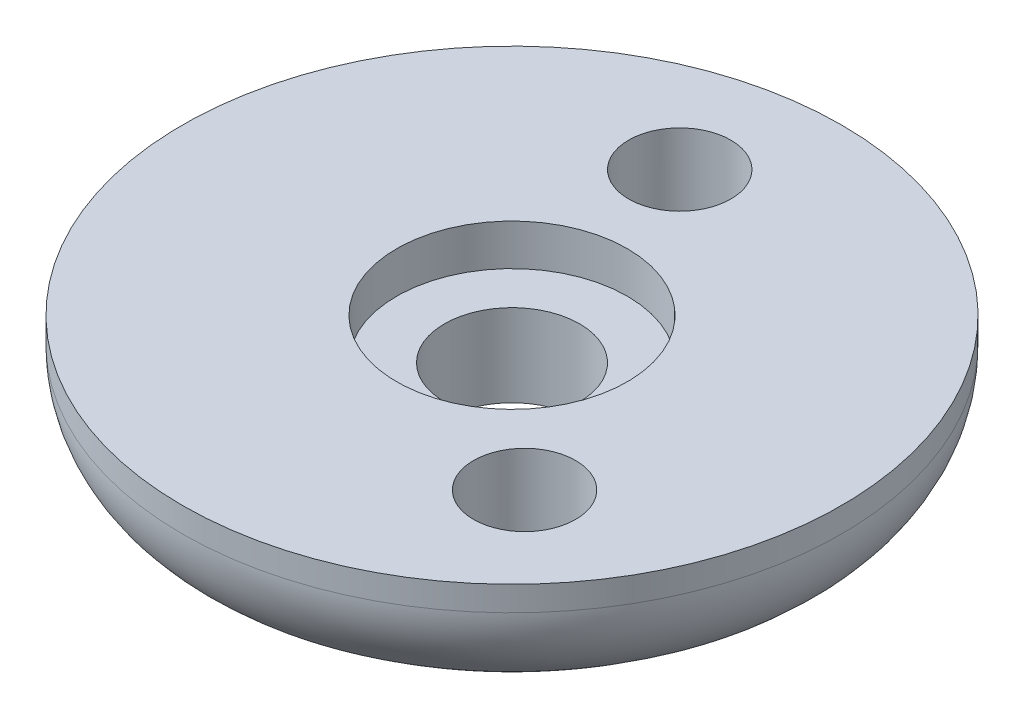
ISO-10303-21;
HEADER;
FILE_DESCRIPTION(('STEP AP214'),'2;1');
FILE_NAME('part.step','',(''),(''),'','','');
FILE_SCHEMA(('AUTOMOTIVE_DESIGN { 1 0 10303 214 1 1 1 1 }'));
ENDSEC;
DATA;
#1=APPLICATION_CONTEXT('core data for automotive mechanical design processes');
#2=APPLICATION_PROTOCOL_DEFINITION('international standard','automotive_design',2000,#1);
#3=PRODUCT_CONTEXT('',#1,'mechanical');
#4=PRODUCT('Part','Part','',(#3));
#5=PRODUCT_RELATED_PRODUCT_CATEGORY('part','',(#4));
#6=PRODUCT_DEFINITION_FORMATION('','',#4);
#7=PRODUCT_DEFINITION_CONTEXT('part definition',#1,'design');
#8=PRODUCT_DEFINITION('design','',#6,#7);
#9=PRODUCT_DEFINITION_SHAPE('','',#8);
#10=(LENGTH_UNIT() NAMED_UNIT(*) SI_UNIT(.MILLI.,.METRE.));
#11=(NAMED_UNIT(*) PLANE_ANGLE_UNIT() SI_UNIT($,.RADIAN.));
#12=(NAMED_UNIT(*) SI_UNIT($,.STERADIAN.) SOLID_ANGLE_UNIT());
#13=UNCERTAINTY_MEASURE_WITH_UNIT(LENGTH_MEASURE(1.E-05),#10,'distance_accuracy_value','');
#14=(GEOMETRIC_REPRESENTATION_CONTEXT(3) GLOBAL_UNCERTAINTY_ASSIGNED_CONTEXT((#13)) GLOBAL_UNIT_ASSIGNED_CONTEXT((#10,
#11,#12)) REPRESENTATION_CONTEXT('',''));
#15=CARTESIAN_POINT('',(0.,0.,0.));
#16=DIRECTION('',(0.,0.,1.));
#17=DIRECTION('',(1.,0.,0.));
#18=AXIS2_PLACEMENT_3D('',#15,#16,#17);
#19=CARTESIAN_POINT('',(0.,-7.5,0.));
#20=DIRECTION('',(0.,1.,0.));
#21=DIRECTION('',(0.,0.,1.));
#22=AXIS2_PLACEMENT_3D('',#19,#20,#21);
#23=CYLINDRICAL_SURFACE('',#22,3.5);
#24=CARTESIAN_POINT('',(0.,-6.25,0.));
#25=DIRECTION('',(0.,-1.,0.));
#26=DIRECTION('',(0.,0.,-1.));
#27=AXIS2_PLACEMENT_3D('',#24,#25,#26);
#28=CIRCLE('',#27,3.5);
#29=CARTESIAN_POINT('',(0.,-6.25,-3.5));
#30=VERTEX_POINT('',#29);
#31=EDGE_CURVE('E135',#30,#30,#28,.T.);
#32=ORIENTED_EDGE('',*,*,#31,.F.);
#33=EDGE_LOOP('',(#32));
#34=FACE_BOUND('',#33,.T.);
#35=CARTESIAN_POINT('',(0.,-7.5,0.));
#36=DIRECTION('',(0.,-1.,0.));
#37=DIRECTION('',(0.,0.,-1.));
#38=AXIS2_PLACEMENT_3D('',#35,#36,#37);
#39=CIRCLE('',#38,3.5);
#40=CARTESIAN_POINT('',(0.,-7.5,-3.5));
#41=VERTEX_POINT('',#40);
#42=EDGE_CURVE('E75',#41,#41,#39,.T.);
#43=ORIENTED_EDGE('',*,*,#42,.T.);
#44=EDGE_LOOP('',(#43));
#45=FACE_BOUND('',#44,.T.);
#46=ADVANCED_FACE('F32',(#34,#45),#23,.F.);
#47=CARTESIAN_POINT('',(0.,-7.5,0.));
#48=DIRECTION('',(0.,-1.,0.));
#49=DIRECTION('',(0.,0.,-1.));
#50=AXIS2_PLACEMENT_3D('',#47,#48,#49);
#51=PLANE('',#50);
#52=CARTESIAN_POINT('',(0.,-7.5,0.));
#53=DIRECTION('',(0.,-1.,0.));
#54=DIRECTION('',(0.,0.,-1.));
#55=AXIS2_PLACEMENT_3D('',#52,#53,#54);
#56=CIRCLE('',#55,2.05);
#57=CARTESIAN_POINT('',(0.,-7.5,-2.05));
#58=VERTEX_POINT('',#57);
#59=EDGE_CURVE('E79',#58,#58,#56,.F.);
#60=ORIENTED_EDGE('',*,*,#59,.F.);
#61=EDGE_LOOP('',(#60));
#62=FACE_BOUND('',#61,.T.);
#63=ORIENTED_EDGE('',*,*,#42,.F.);
#64=EDGE_LOOP('',(#63));
#65=FACE_BOUND('',#64,.T.);
#66=ADVANCED_FACE('F104',(#62,#65),#51,.F.);
#67=CARTESIAN_POINT('',(0.,-10.,0.));
#68=DIRECTION('',(0.,1.,0.));
#69=DIRECTION('',(0.,0.,1.));
#70=AXIS2_PLACEMENT_3D('',#67,#68,#69);
#71=CYLINDRICAL_SURFACE('',#70,2.05);
#72=CARTESIAN_POINT('',(0.,-10.,0.));
#73=DIRECTION('',(0.,-1.,0.));
#74=DIRECTION('',(0.,0.,-1.));
#75=AXIS2_PLACEMENT_3D('',#72,#73,#74);
#76=CIRCLE('',#75,2.05);
#77=CARTESIAN_POINT('',(0.,-10.,-2.05));
#78=VERTEX_POINT('',#77);
#79=EDGE_CURVE('E72',#78,#78,#76,.T.);
#80=ORIENTED_EDGE('',*,*,#79,.T.);
#81=EDGE_LOOP('',(#80));
#82=FACE_BOUND('',#81,.T.);
#83=ORIENTED_EDGE('',*,*,#59,.T.);
#84=EDGE_LOOP('',(#83));
#85=FACE_BOUND('',#84,.T.);
#86=ADVANCED_FACE('F100',(#82,#85),#71,.F.);
#87=CARTESIAN_POINT('',(0.,-10.,0.));
#88=DIRECTION('',(0.,1.,0.));
#89=DIRECTION('',(0.,0.,1.));
#90=AXIS2_PLACEMENT_3D('',#87,#88,#89);
#91=CYLINDRICAL_SURFACE('',#90,10.);
#92=CARTESIAN_POINT('',(0.,-6.25,0.));
#93=DIRECTION('',(0.,-1.,0.));
#94=DIRECTION('',(0.,0.,-1.));
#95=AXIS2_PLACEMENT_3D('',#92,#93,#94);
#96=CIRCLE('',#95,10.);
#97=CARTESIAN_POINT('',(0.,-6.25,-10.));
#98=VERTEX_POINT('',#97);
#99=EDGE_CURVE('E120',#98,#98,#96,.T.);
#100=ORIENTED_EDGE('',*,*,#99,.T.);
#101=EDGE_LOOP('',(#100));
#102=FACE_BOUND('',#101,.T.);
#103=CARTESIAN_POINT('',(0.,-7.,0.));
#104=DIRECTION('',(0.,1.,0.));
#105=DIRECTION('',(0.,0.,1.));
#106=AXIS2_PLACEMENT_3D('',#103,#104,#105);
#107=CIRCLE('',#106,10.);
#108=CARTESIAN_POINT('',(0.,-7.,10.));
#109=VERTEX_POINT('',#108);
#110=EDGE_CURVE('E67',#109,#109,#107,.T.);
#111=ORIENTED_EDGE('',*,*,#110,.T.);
#112=EDGE_LOOP('',(#111));
#113=FACE_BOUND('',#112,.T.);
#114=ADVANCED_FACE('F103',(#102,#113),#91,.T.);
#115=CARTESIAN_POINT('',(0.,-10.,0.));
#116=DIRECTION('',(0.,1.,0.));
#117=DIRECTION('',(0.,0.,1.));
#118=AXIS2_PLACEMENT_3D('',#115,#116,#117);
#119=PLANE('',#118);
#120=CARTESIAN_POINT('',(4.78310190252404,-10.,4.40135617623374));
#121=DIRECTION('',(0.,1.,0.));
#122=DIRECTION('',(0.,0.,1.));
#123=AXIS2_PLACEMENT_3D('',#120,#121,#122);
#124=CIRCLE('',#123,1.55);
#125=CARTESIAN_POINT('',(6.05402523005159,-10.,3.51408288375486));
#126=VERTEX_POINT('',#125);
#127=CARTESIAN_POINT('',(4.00435693052841,-10.,5.74152641489431));
#128=VERTEX_POINT('',#127);
#129=EDGE_CURVE('E64',#126,#128,#124,.T.);
#130=ORIENTED_EDGE('',*,*,#129,.T.);
#131=CARTESIAN_POINT('',(0.,-10.,0.));
#132=DIRECTION('',(0.,1.,0.));
#133=DIRECTION('',(0.,0.,1.));
#134=AXIS2_PLACEMENT_3D('',#131,#132,#133);
#135=CIRCLE('',#134,7.);
#136=CARTESIAN_POINT('',(-2.83228320108191,-10.,-6.40141951983068));
#137=VERTEX_POINT('',#136);
#138=EDGE_CURVE('E11',#128,#137,#135,.F.);
#139=ORIENTED_EDGE('',*,*,#138,.T.);
#140=CARTESIAN_POINT('',(-1.2825584744925,-10.,-6.37220870338594));
#141=DIRECTION('',(0.,1.,0.));
#142=DIRECTION('',(0.,0.,1.));
#143=AXIS2_PLACEMENT_3D('',#140,#141,#142);
#144=CIRCLE('',#143,1.55);
#145=CARTESIAN_POINT('',(0.135191743981975,-10.,-6.99869439198192));
#146=VERTEX_POINT('',#145);
#147=EDGE_CURVE('E65',#137,#146,#144,.T.);
#148=ORIENTED_EDGE('',*,*,#147,.T.);
#149=CARTESIAN_POINT('',(0.,-10.,0.));
#150=DIRECTION('',(0.,1.,0.));
#151=DIRECTION('',(0.,0.,1.));
#152=AXIS2_PLACEMENT_3D('',#149,#150,#151);
#153=CIRCLE('',#152,7.);
#154=EDGE_CURVE('E42',#146,#126,#153,.F.);
#155=ORIENTED_EDGE('',*,*,#154,.T.);
#156=EDGE_LOOP('',(#130,#139,#148,#155));
#157=FACE_BOUND('',#156,.T.);
#158=ORIENTED_EDGE('',*,*,#79,.F.);
#159=EDGE_LOOP('',(#158));
#160=FACE_BOUND('',#159,.T.);
#161=ADVANCED_FACE('F62',(#157,#160),#119,.F.);
#162=CARTESIAN_POINT('',(4.78310190252404,3.,4.40135617623374));
#163=DIRECTION('',(0.,1.,0.));
#164=DIRECTION('',(0.,0.,1.));
#165=AXIS2_PLACEMENT_3D('',#162,#163,#164);
#166=CYLINDRICAL_SURFACE('',#165,1.54999999999999);
#167=CARTESIAN_POINT('',(4.78310190252404,-6.25,4.40135617623374));
#168=DIRECTION('',(0.,-1.,0.));
#169=DIRECTION('',(0.,0.,-1.));
#170=AXIS2_PLACEMENT_3D('',#167,#168,#169);
#171=CIRCLE('',#170,1.54999999999999);
#172=CARTESIAN_POINT('',(4.78310190252404,-6.25,2.85135617623375));
#173=VERTEX_POINT('',#172);
#174=EDGE_CURVE('E138',#173,#173,#171,.F.);
#175=ORIENTED_EDGE('',*,*,#174,.T.);
#176=EDGE_LOOP('',(#175));
#177=FACE_BOUND('',#176,.T.);
#178=ORIENTED_EDGE('',*,*,#129,.F.);
#179=CARTESIAN_POINT('',(6.05402523005159,-10.,3.51408288375486));
#180=CARTESIAN_POINT('',(6.07837642638126,-10.0000015986772,3.5489607841167));
#181=CARTESIAN_POINT('',(6.10127356391482,-9.99925586918454,3.58482172818159));
#182=CARTESIAN_POINT('',(6.14401843904844,-9.99644624741517,3.65824757929055));
#183=CARTESIAN_POINT('',(6.16386753221462,-9.99438294322588,3.69581171918319));
#184=CARTESIAN_POINT('',(6.21852809060005,-9.98649933179938,3.81043399755292));
#185=CARTESIAN_POINT('',(6.24863275092402,-9.97898273194864,3.88968070090783));
#186=CARTESIAN_POINT('',(6.29546102814028,-9.96100993768185,4.05153801842009));
#187=CARTESIAN_POINT('',(6.31220065058441,-9.95055727974766,4.13414448399894));
#188=CARTESIAN_POINT('',(6.33211695686919,-9.92829918293887,4.30085137599471));
#189=CARTESIAN_POINT('',(6.33528460353574,-9.91649284806073,4.38495276042623));
#190=CARTESIAN_POINT('',(6.3278414081899,-9.89261865121791,4.55590350621977));
#191=CARTESIAN_POINT('',(6.31668287936564,-9.88055880785939,4.6427306107177));
#192=CARTESIAN_POINT('',(6.27985312457533,-9.85826575631343,4.81350049794943));
#193=CARTESIAN_POINT('',(6.25418289298358,-9.84803242303263,4.89744347789185));
#194=CARTESIAN_POINT('',(6.18892904374746,-9.8307698807995,5.05999811461538));
#195=CARTESIAN_POINT('',(6.14936129680113,-9.82373703789096,5.13861573121159));
#196=CARTESIAN_POINT('',(6.05735235788914,-9.81383193464933,5.28819875384572));
#197=CARTESIAN_POINT('',(6.00491522147776,-9.8109583655606,5.359166560462));
#198=CARTESIAN_POINT('',(5.89103134931307,-9.80979613002268,5.48861553966101));
#199=CARTESIAN_POINT('',(5.83001753369712,-9.81133242794717,5.5474766963368));
#200=CARTESIAN_POINT('',(5.69936596657021,-9.81841120703508,5.65438664852109));
#201=CARTESIAN_POINT('',(5.62972805058683,-9.82395376461264,5.70243523777113));
#202=CARTESIAN_POINT('',(5.48429511601585,-9.83828735297629,5.7862137206498));
#203=CARTESIAN_POINT('',(5.40854021091439,-9.84705837890741,5.82201691003685));
#204=CARTESIAN_POINT('',(5.25251725809413,-9.86677292525053,5.88091878816926));
#205=CARTESIAN_POINT('',(5.17224869654001,-9.87771669336817,5.90401602722697));
#206=CARTESIAN_POINT('',(5.00613467814121,-9.90087798065979,5.93765103378535));
#207=CARTESIAN_POINT('',(4.92019279869364,-9.91312769015551,5.94769113801805));
#208=CARTESIAN_POINT('',(4.74766597509056,-9.9369135310257,5.95335403529544));
#209=CARTESIAN_POINT('',(4.66108059897172,-9.94844912316121,5.94896606561365));
#210=CARTESIAN_POINT('',(4.48796718607773,-9.96926146129884,5.92555089970068));
#211=CARTESIAN_POINT('',(4.40146978769766,-9.97849251691644,5.90625462929418));
#212=CARTESIAN_POINT('',(4.2328651751814,-9.99254503555234,5.8530809112733));
#213=CARTESIAN_POINT('',(4.15074604270135,-9.99737911274101,5.81924558751751));
#214=CARTESIAN_POINT('',(4.04924347380053,-9.99972863081401,5.76686972337325));
#215=CARTESIAN_POINT('',(4.0266321410922,-10.0000027425883,5.75447650332643));
#216=CARTESIAN_POINT('',(4.00435693052842,-10.,5.7415264148943));
#217=B_SPLINE_CURVE_WITH_KNOTS('',3,(#179,#180,#181,#182,#183,#184,#185,#186,#187,#188,#189,
#190,#191,#192,#193,#194,#195,#196,#197,#198,#199,#200,#201,#202,#203,#204,#205,#206,#207,#208,
#209,#210,#211,#212,#213,#214,#215,#216),.UNSPECIFIED.,.F.,.F.,(4,2,2,2,2,2,2,2,2,2,2,2,2,2,2,2,
2,2,4),(0.,0.127521475599893,0.254986072901818,0.508982677066442,0.762674644656369,
1.01653551193783,1.28039663397967,1.54423967785924,1.80778239242936,2.07124216270049,
2.32439104383069,2.57754475357145,2.82915552884664,3.08079500574703,3.34176881928819,
3.60293735229253,3.86893299789443,4.13416311885836,4.21148354195658),.UNSPECIFIED.);
#218=EDGE_CURVE('E71',#126,#128,#217,.T.);
#219=ORIENTED_EDGE('',*,*,#218,.T.);
#220=EDGE_LOOP('',(#178,#219));
#221=FACE_BOUND('',#220,.T.);
#222=ADVANCED_FACE('F70',(#177,#221),#166,.F.);
#223=CARTESIAN_POINT('',(-1.2825584744925,3.,-6.37220870338594));
#224=DIRECTION('',(0.,1.,0.));
#225=DIRECTION('',(0.,0.,1.));
#226=AXIS2_PLACEMENT_3D('',#223,#224,#225);
#227=CYLINDRICAL_SURFACE('',#226,1.54999999999999);
#228=CARTESIAN_POINT('',(-1.2825584744925,-6.25,-6.37220870338594));
#229=DIRECTION('',(0.,-1.,0.));
#230=DIRECTION('',(0.,0.,-1.));
#231=AXIS2_PLACEMENT_3D('',#228,#229,#230);
#232=CIRCLE('',#231,1.54999999999999);
#233=CARTESIAN_POINT('',(-1.2825584744925,-6.25,-7.92220870338593));
#234=VERTEX_POINT('',#233);
#235=EDGE_CURVE('E37',#234,#234,#232,.F.);
#236=ORIENTED_EDGE('',*,*,#235,.T.);
#237=EDGE_LOOP('',(#236));
#238=FACE_BOUND('',#237,.T.);
#239=ORIENTED_EDGE('',*,*,#147,.F.);
#240=CARTESIAN_POINT('',(-2.83228320108191,-10.,-6.40141951983068));
#241=CARTESIAN_POINT('',(-2.83148301728236,-10.0000015986772,-6.44394960802978));
#242=CARTESIAN_POINT('',(-2.82892865661492,-9.99925586918454,-6.48642032097455));
#243=CARTESIAN_POINT('',(-2.82035135460159,-9.99644624741517,-6.57094788956277));
#244=CARTESIAN_POINT('',(-2.81432996085201,-9.99438294322588,-6.61300492134944));
#245=CARTESIAN_POINT('',(-2.79117799669797,-9.98649933179938,-6.73786496258556));
#246=CARTESIAN_POINT('',(-2.76895313498513,-9.97898273194864,-6.81967196771157));
#247=CARTESIAN_POINT('',(-2.71170066286105,-9.96100993768185,-6.97814225898092));
#248=CARTESIAN_POINT('',(-2.67668843968652,-9.95055727974766,-7.05481159668107));
#249=CARTESIAN_POINT('',(-2.59481321736546,-9.92829918293887,-7.20138681649941));
#250=CARTESIAN_POINT('',(-2.54794234388465,-9.91649284806073,-7.27128816175003));
#251=CARTESIAN_POINT('',(-2.44143834511157,-9.89261865121791,-7.40521521984386));
#252=CARTESIAN_POINT('',(-2.38137521413737,-9.88055880785939,-7.46890100427488));
#253=CARTESIAN_POINT('',(-2.2512032953629,-9.85826575631343,-7.58540875846155));
#254=CARTESIAN_POINT('',(-2.18109519611199,-9.84803242303263,-7.63823147224088));
#255=CARTESIAN_POINT('',(-2.03275650497373,-9.8307698807995,-7.73138568562835));
#256=CARTESIAN_POINT('',(-1.9545352496594,-9.82373703789096,-7.77173133539045));
#257=CARTESIAN_POINT('',(-1.79217575974751,-9.81383193464933,-7.83866504539989));
#258=CARTESIAN_POINT('',(-1.70803939513775,-9.8109583655606,-7.86525743155091));
#259=CARTESIAN_POINT('',(-1.5398172062738,-9.80979613002268,-7.90304459509504));
#260=CARTESIAN_POINT('',(-1.45585827272193,-9.81133242794717,-7.91480125014917));
#261=CARTESIAN_POINT('',(-1.28731884135732,-9.81841120703508,-7.92449815398798));
#262=CARTESIAN_POINT('',(-1.20273833171929,-9.82395376461264,-7.92243813923158));
#263=CARTESIAN_POINT('',(-1.03583685941402,-9.83828735297629,-7.90473302150494));
#264=CARTESIAN_POINT('',(-0.953505267072938,-9.8470583789074,-7.88917079416443));
#265=CARTESIAN_POINT('',(-0.792658391430227,-9.86677292525053,-7.84511542388728));
#266=CARTESIAN_POINT('',(-0.714143544532119,-9.87771669336817,-7.81662080610387));
#267=CARTESIAN_POINT('',(-0.559984319827799,-9.90087798065979,-7.74619272780166));
#268=CARTESIAN_POINT('',(-0.484554453626734,-9.91312769015551,-7.70379997345763));
#269=CARTESIAN_POINT('',(-0.341648753841418,-9.9369135310257,-7.60697263105368));
#270=CARTESIAN_POINT('',(-0.274178896963387,-9.94844912316121,-7.55252908186345));
#271=CARTESIAN_POINT('',(-0.147890293181529,-9.96926146129884,-7.43183230364066));
#272=CARTESIAN_POINT('',(-0.089254491092017,-9.97849251691644,-7.36537939782427));
#273=CARTESIAN_POINT('',(0.0158947785014115,-9.99254503555234,-7.22325765158573));
#274=CARTESIAN_POINT('',(0.0624426479308963,-9.99737911274101,-7.14761588465429));
#275=CARTESIAN_POINT('',(0.113774190624312,-9.99972863081401,-7.04558120739681));
#276=CARTESIAN_POINT('',(0.124782591078882,-10.0000027425883,-7.02226427386327));
#277=CARTESIAN_POINT('',(0.13519174398197,-10.,-6.99869439198191));
#278=B_SPLINE_CURVE_WITH_KNOTS('',3,(#240,#241,#242,#243,#244,#245,#246,#247,#248,#249,#250,
#251,#252,#253,#254,#255,#256,#257,#258,#259,#260,#261,#262,#263,#264,#265,#266,#267,#268,#269,
#270,#271,#272,#273,#274,#275,#276,#277),.UNSPECIFIED.,.F.,.F.,(4,2,2,2,2,2,2,2,2,2,2,2,2,2,2,2,
2,2,4),(0.,0.127521475599895,0.254986072901819,0.508982677066441,0.762674644656368,
1.01653551193783,1.28039663397967,1.54423967785924,1.80778239242935,2.07124216270048,
2.32439104383069,2.57754475357145,2.82915552884664,3.08079500574703,3.34176881928819,
3.60293735229253,3.86893299789443,4.13416311885836,4.21148354195658),.UNSPECIFIED.);
#279=EDGE_CURVE('E49',#137,#146,#278,.T.);
#280=ORIENTED_EDGE('',*,*,#279,.T.);
#281=EDGE_LOOP('',(#239,#280));
#282=FACE_BOUND('',#281,.T.);
#283=ADVANCED_FACE('F96',(#238,#282),#227,.F.);
#284=CARTESIAN_POINT('',(0.,-7.,0.));
#285=DIRECTION('',(0.,1.,0.));
#286=DIRECTION('',(0.,0.,1.));
#287=AXIS2_PLACEMENT_3D('',#284,#285,#286);
#288=TOROIDAL_SURFACE('',#287,7.,3.);
#289=ORIENTED_EDGE('',*,*,#279,.F.);
#290=ORIENTED_EDGE('',*,*,#138,.F.);
#291=ORIENTED_EDGE('',*,*,#218,.F.);
#292=ORIENTED_EDGE('',*,*,#154,.F.);
#293=EDGE_LOOP('',(#289,#290,#291,#292));
#294=FACE_BOUND('',#293,.T.);
#295=ORIENTED_EDGE('',*,*,#110,.F.);
#296=EDGE_LOOP('',(#295));
#297=FACE_BOUND('',#296,.T.);
#298=ADVANCED_FACE('F34',(#294,#297),#288,.T.);
#299=CARTESIAN_POINT('',(0.,-6.25,0.));
#300=DIRECTION('',(0.,-1.,0.));
#301=DIRECTION('',(0.,0.,-1.));
#302=AXIS2_PLACEMENT_3D('',#299,#300,#301);
#303=PLANE('',#302);
#304=ORIENTED_EDGE('',*,*,#31,.T.);
#305=EDGE_LOOP('',(#304));
#306=FACE_BOUND('',#305,.T.);
#307=ORIENTED_EDGE('',*,*,#235,.F.);
#308=EDGE_LOOP('',(#307));
#309=FACE_BOUND('',#308,.T.);
#310=ORIENTED_EDGE('',*,*,#99,.F.);
#311=EDGE_LOOP('',(#310));
#312=FACE_BOUND('',#311,.T.);
#313=ORIENTED_EDGE('',*,*,#174,.F.);
#314=EDGE_LOOP('',(#313));
#315=FACE_BOUND('',#314,.T.);
#316=ADVANCED_FACE('F124',(#306,#309,#312,#315),#303,.F.);
#317=CLOSED_SHELL('',(#46,#66,#86,#114,#161,#222,#283,#298,#316));
#318=MANIFOLD_SOLID_BREP('B2',#317);
#319=ADVANCED_BREP_SHAPE_REPRESENTATION('',(#18,#318),#14);
#320=SHAPE_DEFINITION_REPRESENTATION(#9,#319);
ENDSEC;
END-ISO-10303-21;
